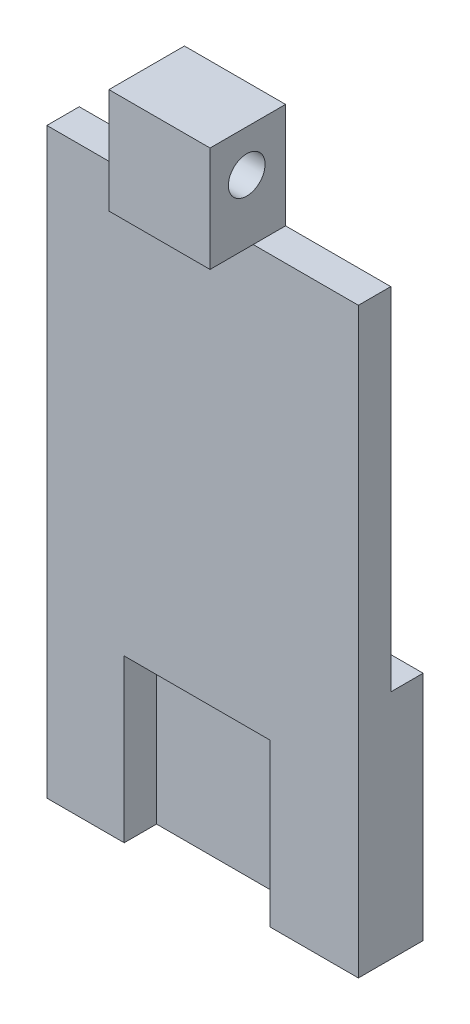
ISO-10303-21;
HEADER;
FILE_DESCRIPTION(('STEP AP214'),'2;1');
FILE_NAME('part.step','',(''),(''),'','','');
FILE_SCHEMA(('AUTOMOTIVE_DESIGN { 1 0 10303 214 1 1 1 1 }'));
ENDSEC;
DATA;
#1=APPLICATION_CONTEXT('core data for automotive mechanical design processes');
#2=APPLICATION_PROTOCOL_DEFINITION('international standard','automotive_design',2000,#1);
#3=PRODUCT_CONTEXT('',#1,'mechanical');
#4=PRODUCT('Part','Part','',(#3));
#5=PRODUCT_RELATED_PRODUCT_CATEGORY('part','',(#4));
#6=PRODUCT_DEFINITION_FORMATION('','',#4);
#7=PRODUCT_DEFINITION_CONTEXT('part definition',#1,'design');
#8=PRODUCT_DEFINITION('design','',#6,#7);
#9=PRODUCT_DEFINITION_SHAPE('','',#8);
#10=(LENGTH_UNIT() NAMED_UNIT(*) SI_UNIT(.MILLI.,.METRE.));
#11=(NAMED_UNIT(*) PLANE_ANGLE_UNIT() SI_UNIT($,.RADIAN.));
#12=(NAMED_UNIT(*) SI_UNIT($,.STERADIAN.) SOLID_ANGLE_UNIT());
#13=UNCERTAINTY_MEASURE_WITH_UNIT(LENGTH_MEASURE(1.E-05),#10,'distance_accuracy_value','');
#14=(GEOMETRIC_REPRESENTATION_CONTEXT(3) GLOBAL_UNCERTAINTY_ASSIGNED_CONTEXT((#13)) GLOBAL_UNIT_ASSIGNED_CONTEXT((#10,
#11,#12)) REPRESENTATION_CONTEXT('',''));
#15=CARTESIAN_POINT('',(0.,0.,0.));
#16=DIRECTION('',(0.,0.,1.));
#17=DIRECTION('',(1.,0.,0.));
#18=AXIS2_PLACEMENT_3D('',#15,#16,#17);
#19=CARTESIAN_POINT('',(6.2499028068027,-30.57438126,3.));
#20=DIRECTION('',(1.,0.,0.));
#21=DIRECTION('',(0.,0.,-1.));
#22=AXIS2_PLACEMENT_3D('',#19,#20,#21);
#23=PLANE('',#22);
#24=DIRECTION('',(0.,-1.,0.));
#25=VECTOR('',#24,1.);
#26=CARTESIAN_POINT('',(6.2499028068027,-30.57438126,0.));
#27=LINE('',#26,#25);
#28=CARTESIAN_POINT('',(6.2499028068027,-30.57438126,0.));
#29=VERTEX_POINT('',#28);
#30=CARTESIAN_POINT('',(6.24990280680269,-45.57438126,0.));
#31=VERTEX_POINT('',#30);
#32=EDGE_CURVE('E150',#29,#31,#27,.T.);
#33=ORIENTED_EDGE('',*,*,#32,.T.);
#34=DIRECTION('',(0.,0.,-1.));
#35=VECTOR('',#34,1.);
#36=CARTESIAN_POINT('',(6.2499028068027,-45.57438126,3.));
#37=LINE('',#36,#35);
#38=CARTESIAN_POINT('',(6.2499028068027,-45.57438126,3.));
#39=VERTEX_POINT('',#38);
#40=EDGE_CURVE('E11',#39,#31,#37,.T.);
#41=ORIENTED_EDGE('',*,*,#40,.F.);
#42=DIRECTION('',(0.,-1.,0.));
#43=VECTOR('',#42,1.);
#44=CARTESIAN_POINT('',(6.2499028068027,-30.57438126,3.));
#45=LINE('',#44,#43);
#46=CARTESIAN_POINT('',(6.2499028068027,-30.57438126,3.));
#47=VERTEX_POINT('',#46);
#48=EDGE_CURVE('E182',#47,#39,#45,.T.);
#49=ORIENTED_EDGE('',*,*,#48,.F.);
#50=DIRECTION('',(0.,0.,-1.));
#51=VECTOR('',#50,1.);
#52=CARTESIAN_POINT('',(6.2499028068027,-30.57438126,3.));
#53=LINE('',#52,#51);
#54=EDGE_CURVE('E146',#47,#29,#53,.T.);
#55=ORIENTED_EDGE('',*,*,#54,.T.);
#56=EDGE_LOOP('',(#33,#41,#49,#55));
#57=FACE_BOUND('',#56,.T.);
#58=ADVANCED_FACE('F38',(#57),#23,.F.);
#59=CARTESIAN_POINT('',(14.436666665,-30.57438126,3.));
#60=DIRECTION('',(-1.,0.,0.));
#61=DIRECTION('',(0.,0.,1.));
#62=AXIS2_PLACEMENT_3D('',#59,#60,#61);
#63=PLANE('',#62);
#64=DIRECTION('',(0.,0.,-1.));
#65=VECTOR('',#64,1.);
#66=CARTESIAN_POINT('',(14.436666665,-45.57438126,3.));
#67=LINE('',#66,#65);
#68=CARTESIAN_POINT('',(14.436666665,-45.57438126,3.));
#69=VERTEX_POINT('',#68);
#70=CARTESIAN_POINT('',(14.436666665,-45.57438126,-3.));
#71=VERTEX_POINT('',#70);
#72=EDGE_CURVE('E46',#69,#71,#67,.T.);
#73=ORIENTED_EDGE('',*,*,#72,.T.);
#74=DIRECTION('',(0.,1.,0.));
#75=VECTOR('',#74,1.);
#76=CARTESIAN_POINT('',(14.436666665,-24.1093376695065,-3.));
#77=LINE('',#76,#75);
#78=CARTESIAN_POINT('',(14.436666665,-24.1093376695065,-3.));
#79=VERTEX_POINT('',#78);
#80=EDGE_CURVE('E223',#71,#79,#77,.T.);
#81=ORIENTED_EDGE('',*,*,#80,.T.);
#82=DIRECTION('',(0.,0.,1.));
#83=VECTOR('',#82,1.);
#84=CARTESIAN_POINT('',(14.436666665,-24.1093376695065,-3.));
#85=LINE('',#84,#83);
#86=CARTESIAN_POINT('',(14.436666665,-24.1093376695065,0.));
#87=VERTEX_POINT('',#86);
#88=EDGE_CURVE('E249',#79,#87,#85,.T.);
#89=ORIENTED_EDGE('',*,*,#88,.T.);
#90=DIRECTION('',(0.,1.,0.));
#91=VECTOR('',#90,1.);
#92=CARTESIAN_POINT('',(14.436666665,-30.57438126,0.));
#93=LINE('',#92,#91);
#94=CARTESIAN_POINT('',(14.436666665,8.42561874000001,0.));
#95=VERTEX_POINT('',#94);
#96=EDGE_CURVE('E154',#87,#95,#93,.T.);
#97=ORIENTED_EDGE('',*,*,#96,.T.);
#98=DIRECTION('',(0.,0.,-1.));
#99=VECTOR('',#98,1.);
#100=CARTESIAN_POINT('',(14.436666665,8.42561874000001,3.));
#101=LINE('',#100,#99);
#102=CARTESIAN_POINT('',(14.436666665,8.42561874000001,3.));
#103=VERTEX_POINT('',#102);
#104=EDGE_CURVE('E210',#103,#95,#101,.T.);
#105=ORIENTED_EDGE('',*,*,#104,.F.);
#106=DIRECTION('',(0.,1.,0.));
#107=VECTOR('',#106,1.);
#108=CARTESIAN_POINT('',(14.436666665,-45.57438126,3.));
#109=LINE('',#108,#107);
#110=EDGE_CURVE('E226',#69,#103,#109,.T.);
#111=ORIENTED_EDGE('',*,*,#110,.F.);
#112=EDGE_LOOP('',(#73,#81,#89,#97,#105,#111));
#113=FACE_BOUND('',#112,.T.);
#114=ADVANCED_FACE('F220',(#113),#63,.F.);
#115=CARTESIAN_POINT('',(14.436666665,8.42561874000001,3.));
#116=DIRECTION('',(0.,-1.,0.));
#117=DIRECTION('',(1.,0.,0.));
#118=AXIS2_PLACEMENT_3D('',#115,#116,#117);
#119=PLANE('',#118);
#120=DIRECTION('',(-1.,0.,0.));
#121=VECTOR('',#120,1.);
#122=CARTESIAN_POINT('',(14.436666665,8.42561874000001,0.));
#123=LINE('',#122,#121);
#124=CARTESIAN_POINT('',(4.686666665,8.42561874000001,0.));
#125=VERTEX_POINT('',#124);
#126=EDGE_CURVE('E158',#95,#125,#123,.T.);
#127=ORIENTED_EDGE('',*,*,#126,.T.);
#128=DIRECTION('',(0.,0.,-1.));
#129=VECTOR('',#128,1.);
#130=CARTESIAN_POINT('',(4.686666665,8.42561874000001,3.));
#131=LINE('',#130,#129);
#132=CARTESIAN_POINT('',(4.686666665,8.42561874000001,3.));
#133=VERTEX_POINT('',#132);
#134=EDGE_CURVE('E206',#133,#125,#131,.T.);
#135=ORIENTED_EDGE('',*,*,#134,.F.);
#136=DIRECTION('',(-1.,0.,0.));
#137=VECTOR('',#136,1.);
#138=CARTESIAN_POINT('',(14.436666665,8.42561874000001,3.));
#139=LINE('',#138,#137);
#140=EDGE_CURVE('E292',#103,#133,#139,.T.);
#141=ORIENTED_EDGE('',*,*,#140,.F.);
#142=ORIENTED_EDGE('',*,*,#104,.T.);
#143=EDGE_LOOP('',(#127,#135,#141,#142));
#144=FACE_BOUND('',#143,.T.);
#145=ADVANCED_FACE('F356',(#144),#119,.F.);
#146=CARTESIAN_POINT('',(4.686666665,8.42561874000001,3.));
#147=DIRECTION('',(-1.,0.,0.));
#148=DIRECTION('',(0.,0.,1.));
#149=AXIS2_PLACEMENT_3D('',#146,#147,#148);
#150=PLANE('',#149);
#151=CARTESIAN_POINT('',(4.686666665,14.31561874,3.6));
#152=DIRECTION('',(-1.,0.,0.));
#153=DIRECTION('',(0.,0.,1.));
#154=AXIS2_PLACEMENT_3D('',#151,#152,#153);
#155=CIRCLE('',#154,1.7);
#156=CARTESIAN_POINT('',(4.686666665,14.31561874,5.3));
#157=VERTEX_POINT('',#156);
#158=EDGE_CURVE('E252',#157,#157,#155,.T.);
#159=ORIENTED_EDGE('',*,*,#158,.T.);
#160=EDGE_LOOP('',(#159));
#161=FACE_BOUND('',#160,.T.);
#162=DIRECTION('',(0.,1.,0.));
#163=VECTOR('',#162,1.);
#164=CARTESIAN_POINT('',(4.686666665,8.42561874000001,0.));
#165=LINE('',#164,#163);
#166=CARTESIAN_POINT('',(4.686666665,18.17561874,0.));
#167=VERTEX_POINT('',#166);
#168=EDGE_CURVE('E161',#125,#167,#165,.T.);
#169=ORIENTED_EDGE('',*,*,#168,.T.);
#170=DIRECTION('',(0.,0.,-1.));
#171=VECTOR('',#170,1.);
#172=CARTESIAN_POINT('',(4.686666665,18.17561874,3.));
#173=LINE('',#172,#171);
#174=CARTESIAN_POINT('',(4.686666665,18.17561874,7.));
#175=VERTEX_POINT('',#174);
#176=EDGE_CURVE('E202',#175,#167,#173,.T.);
#177=ORIENTED_EDGE('',*,*,#176,.F.);
#178=DIRECTION('',(0.,1.,0.));
#179=VECTOR('',#178,1.);
#180=CARTESIAN_POINT('',(4.686666665,18.17561874,7.));
#181=LINE('',#180,#179);
#182=CARTESIAN_POINT('',(4.686666665,8.42561874000001,7.));
#183=VERTEX_POINT('',#182);
#184=EDGE_CURVE('E268',#183,#175,#181,.T.);
#185=ORIENTED_EDGE('',*,*,#184,.F.);
#186=DIRECTION('',(0.,0.,-1.));
#187=VECTOR('',#186,1.);
#188=CARTESIAN_POINT('',(4.686666665,8.42561874000001,7.));
#189=LINE('',#188,#187);
#190=EDGE_CURVE('E276',#183,#133,#189,.T.);
#191=ORIENTED_EDGE('',*,*,#190,.T.);
#192=ORIENTED_EDGE('',*,*,#134,.T.);
#193=EDGE_LOOP('',(#169,#177,#185,#191,#192));
#194=FACE_BOUND('',#193,.T.);
#195=ADVANCED_FACE('F350',(#161,#194),#150,.F.);
#196=CARTESIAN_POINT('',(-4.686666665,18.17561874,3.));
#197=DIRECTION('',(0.,-1.,0.));
#198=DIRECTION('',(0.,0.,-1.));
#199=AXIS2_PLACEMENT_3D('',#196,#197,#198);
#200=PLANE('',#199);
#201=DIRECTION('',(-1.,0.,0.));
#202=VECTOR('',#201,1.);
#203=CARTESIAN_POINT('',(-4.686666665,18.17561874,0.));
#204=LINE('',#203,#202);
#205=CARTESIAN_POINT('',(-4.686666665,18.17561874,0.));
#206=VERTEX_POINT('',#205);
#207=EDGE_CURVE('E164',#167,#206,#204,.T.);
#208=ORIENTED_EDGE('',*,*,#207,.T.);
#209=DIRECTION('',(0.,0.,-1.));
#210=VECTOR('',#209,1.);
#211=CARTESIAN_POINT('',(-4.686666665,18.17561874,3.));
#212=LINE('',#211,#210);
#213=CARTESIAN_POINT('',(-4.686666665,18.17561874,7.));
#214=VERTEX_POINT('',#213);
#215=EDGE_CURVE('E198',#214,#206,#212,.T.);
#216=ORIENTED_EDGE('',*,*,#215,.F.);
#217=DIRECTION('',(-1.,0.,0.));
#218=VECTOR('',#217,1.);
#219=CARTESIAN_POINT('',(-4.686666665,18.17561874,7.));
#220=LINE('',#219,#218);
#221=EDGE_CURVE('E272',#175,#214,#220,.T.);
#222=ORIENTED_EDGE('',*,*,#221,.F.);
#223=ORIENTED_EDGE('',*,*,#176,.T.);
#224=EDGE_LOOP('',(#208,#216,#222,#223));
#225=FACE_BOUND('',#224,.T.);
#226=ADVANCED_FACE('F336',(#225),#200,.F.);
#227=CARTESIAN_POINT('',(-4.686666665,18.17561874,3.));
#228=DIRECTION('',(1.,0.,0.));
#229=DIRECTION('',(0.,1.,0.));
#230=AXIS2_PLACEMENT_3D('',#227,#228,#229);
#231=PLANE('',#230);
#232=CARTESIAN_POINT('',(-4.686666665,14.31561874,3.6));
#233=DIRECTION('',(-1.,0.,0.));
#234=DIRECTION('',(0.,-1.,0.));
#235=AXIS2_PLACEMENT_3D('',#232,#233,#234);
#236=CIRCLE('',#235,1.7);
#237=CARTESIAN_POINT('',(-4.686666665,12.61561874,3.6));
#238=VERTEX_POINT('',#237);
#239=EDGE_CURVE('E549',#238,#238,#236,.T.);
#240=ORIENTED_EDGE('',*,*,#239,.F.);
#241=EDGE_LOOP('',(#240));
#242=FACE_BOUND('',#241,.T.);
#243=DIRECTION('',(0.,-1.,0.));
#244=VECTOR('',#243,1.);
#245=CARTESIAN_POINT('',(-4.686666665,18.17561874,0.));
#246=LINE('',#245,#244);
#247=CARTESIAN_POINT('',(-4.686666665,8.42561874000001,0.));
#248=VERTEX_POINT('',#247);
#249=EDGE_CURVE('E167',#206,#248,#246,.T.);
#250=ORIENTED_EDGE('',*,*,#249,.T.);
#251=DIRECTION('',(0.,0.,-1.));
#252=VECTOR('',#251,1.);
#253=CARTESIAN_POINT('',(-4.686666665,8.42561874000001,3.));
#254=LINE('',#253,#252);
#255=CARTESIAN_POINT('',(-4.686666665,8.42561874000001,3.));
#256=VERTEX_POINT('',#255);
#257=EDGE_CURVE('E194',#256,#248,#254,.T.);
#258=ORIENTED_EDGE('',*,*,#257,.F.);
#259=DIRECTION('',(0.,0.,-1.));
#260=VECTOR('',#259,1.);
#261=CARTESIAN_POINT('',(-4.686666665,8.42561874000001,7.));
#262=LINE('',#261,#260);
#263=CARTESIAN_POINT('',(-4.686666665,8.42561874000001,7.));
#264=VERTEX_POINT('',#263);
#265=EDGE_CURVE('E155',#264,#256,#262,.T.);
#266=ORIENTED_EDGE('',*,*,#265,.F.);
#267=DIRECTION('',(0.,-1.,0.));
#268=VECTOR('',#267,1.);
#269=CARTESIAN_POINT('',(-4.686666665,18.17561874,7.));
#270=LINE('',#269,#268);
#271=EDGE_CURVE('E260',#214,#264,#270,.T.);
#272=ORIENTED_EDGE('',*,*,#271,.F.);
#273=ORIENTED_EDGE('',*,*,#215,.T.);
#274=EDGE_LOOP('',(#250,#258,#266,#272,#273));
#275=FACE_BOUND('',#274,.T.);
#276=ADVANCED_FACE('F345',(#242,#275),#231,.F.);
#277=CARTESIAN_POINT('',(-4.686666665,8.42561874000001,3.));
#278=DIRECTION('',(0.,-1.,0.));
#279=DIRECTION('',(1.,0.,0.));
#280=AXIS2_PLACEMENT_3D('',#277,#278,#279);
#281=PLANE('',#280);
#282=DIRECTION('',(-1.,0.,0.));
#283=VECTOR('',#282,1.);
#284=CARTESIAN_POINT('',(-4.686666665,8.42561874000001,0.));
#285=LINE('',#284,#283);
#286=CARTESIAN_POINT('',(-14.436666665,8.42561874000001,0.));
#287=VERTEX_POINT('',#286);
#288=EDGE_CURVE('E170',#248,#287,#285,.T.);
#289=ORIENTED_EDGE('',*,*,#288,.T.);
#290=DIRECTION('',(0.,0.,-1.));
#291=VECTOR('',#290,1.);
#292=CARTESIAN_POINT('',(-14.436666665,8.42561874000001,3.));
#293=LINE('',#292,#291);
#294=CARTESIAN_POINT('',(-14.436666665,8.42561874000001,3.));
#295=VERTEX_POINT('',#294);
#296=EDGE_CURVE('E190',#295,#287,#293,.T.);
#297=ORIENTED_EDGE('',*,*,#296,.F.);
#298=DIRECTION('',(-1.,0.,0.));
#299=VECTOR('',#298,1.);
#300=CARTESIAN_POINT('',(-4.686666665,8.42561874000001,3.));
#301=LINE('',#300,#299);
#302=EDGE_CURVE('E296',#256,#295,#301,.T.);
#303=ORIENTED_EDGE('',*,*,#302,.F.);
#304=ORIENTED_EDGE('',*,*,#257,.T.);
#305=EDGE_LOOP('',(#289,#297,#303,#304));
#306=FACE_BOUND('',#305,.T.);
#307=ADVANCED_FACE('F303',(#306),#281,.F.);
#308=CARTESIAN_POINT('',(-14.436666665,-30.57438126,3.));
#309=DIRECTION('',(1.,0.,0.));
#310=DIRECTION('',(0.,0.,-1.));
#311=AXIS2_PLACEMENT_3D('',#308,#309,#310);
#312=PLANE('',#311);
#313=DIRECTION('',(0.,-1.,0.));
#314=VECTOR('',#313,1.);
#315=CARTESIAN_POINT('',(-14.436666665,-30.57438126,0.));
#316=LINE('',#315,#314);
#317=CARTESIAN_POINT('',(-14.436666665,-24.1093376695065,0.));
#318=VERTEX_POINT('',#317);
#319=EDGE_CURVE('E89',#287,#318,#316,.T.);
#320=ORIENTED_EDGE('',*,*,#319,.T.);
#321=DIRECTION('',(0.,0.,1.));
#322=VECTOR('',#321,1.);
#323=CARTESIAN_POINT('',(-14.436666665,-24.1093376695065,-3.));
#324=LINE('',#323,#322);
#325=CARTESIAN_POINT('',(-14.436666665,-24.1093376695065,-3.));
#326=VERTEX_POINT('',#325);
#327=EDGE_CURVE('E53',#326,#318,#324,.T.);
#328=ORIENTED_EDGE('',*,*,#327,.F.);
#329=DIRECTION('',(0.,-1.,0.));
#330=VECTOR('',#329,1.);
#331=CARTESIAN_POINT('',(-14.436666665,-24.1093376695065,-3.));
#332=LINE('',#331,#330);
#333=CARTESIAN_POINT('',(-14.436666665,-45.57438126,-3.));
#334=VERTEX_POINT('',#333);
#335=EDGE_CURVE('E240',#326,#334,#332,.T.);
#336=ORIENTED_EDGE('',*,*,#335,.T.);
#337=DIRECTION('',(0.,0.,-1.));
#338=VECTOR('',#337,1.);
#339=CARTESIAN_POINT('',(-14.436666665,-45.57438126,3.));
#340=LINE('',#339,#338);
#341=CARTESIAN_POINT('',(-14.436666665,-45.57438126,3.));
#342=VERTEX_POINT('',#341);
#343=EDGE_CURVE('E138',#342,#334,#340,.T.);
#344=ORIENTED_EDGE('',*,*,#343,.F.);
#345=DIRECTION('',(0.,-1.,0.));
#346=VECTOR('',#345,1.);
#347=CARTESIAN_POINT('',(-14.436666665,8.42561874000001,3.));
#348=LINE('',#347,#346);
#349=EDGE_CURVE('E123',#295,#342,#348,.T.);
#350=ORIENTED_EDGE('',*,*,#349,.F.);
#351=ORIENTED_EDGE('',*,*,#296,.T.);
#352=EDGE_LOOP('',(#320,#328,#336,#344,#350,#351));
#353=FACE_BOUND('',#352,.T.);
#354=ADVANCED_FACE('F305',(#353),#312,.F.);
#355=CARTESIAN_POINT('',(-14.436666665,-45.57438126,3.));
#356=DIRECTION('',(0.,1.,0.));
#357=DIRECTION('',(0.,0.,1.));
#358=AXIS2_PLACEMENT_3D('',#355,#356,#357);
#359=PLANE('',#358);
#360=ORIENTED_EDGE('',*,*,#343,.T.);
#361=DIRECTION('',(1.,0.,0.));
#362=VECTOR('',#361,1.);
#363=CARTESIAN_POINT('',(-14.436666665,-45.57438126,-3.));
#364=LINE('',#363,#362);
#365=EDGE_CURVE('E234',#334,#71,#364,.T.);
#366=ORIENTED_EDGE('',*,*,#365,.T.);
#367=ORIENTED_EDGE('',*,*,#72,.F.);
#368=DIRECTION('',(1.,0.,0.));
#369=VECTOR('',#368,1.);
#370=CARTESIAN_POINT('',(6.2499028068027,-45.57438126,3.));
#371=LINE('',#370,#369);
#372=EDGE_CURVE('E97',#39,#69,#371,.T.);
#373=ORIENTED_EDGE('',*,*,#372,.F.);
#374=ORIENTED_EDGE('',*,*,#40,.T.);
#375=DIRECTION('',(1.,0.,0.));
#376=VECTOR('',#375,1.);
#377=CARTESIAN_POINT('',(-14.436666665,-45.57438126,0.));
#378=LINE('',#377,#376);
#379=CARTESIAN_POINT('',(-7.2700971931973,-45.57438126,0.));
#380=VERTEX_POINT('',#379);
#381=EDGE_CURVE('E134',#380,#31,#378,.T.);
#382=ORIENTED_EDGE('',*,*,#381,.F.);
#383=DIRECTION('',(0.,0.,-1.));
#384=VECTOR('',#383,1.);
#385=CARTESIAN_POINT('',(-7.2700971931973,-45.57438126,3.));
#386=LINE('',#385,#384);
#387=CARTESIAN_POINT('',(-7.2700971931973,-45.57438126,3.));
#388=VERTEX_POINT('',#387);
#389=EDGE_CURVE('E130',#388,#380,#386,.T.);
#390=ORIENTED_EDGE('',*,*,#389,.F.);
#391=DIRECTION('',(1.,0.,0.));
#392=VECTOR('',#391,1.);
#393=CARTESIAN_POINT('',(-14.436666665,-45.57438126,3.));
#394=LINE('',#393,#392);
#395=EDGE_CURVE('E116',#342,#388,#394,.T.);
#396=ORIENTED_EDGE('',*,*,#395,.F.);
#397=EDGE_LOOP('',(#360,#366,#367,#373,#374,#382,#390,#396));
#398=FACE_BOUND('',#397,.T.);
#399=ADVANCED_FACE('F131',(#398),#359,.F.);
#400=CARTESIAN_POINT('',(-7.2700971931973,-45.57438126,3.));
#401=DIRECTION('',(-1.,0.,0.));
#402=DIRECTION('',(0.,-1.,0.));
#403=AXIS2_PLACEMENT_3D('',#400,#401,#402);
#404=PLANE('',#403);
#405=DIRECTION('',(0.,1.,0.));
#406=VECTOR('',#405,1.);
#407=CARTESIAN_POINT('',(-7.2700971931973,-45.57438126,0.));
#408=LINE('',#407,#406);
#409=CARTESIAN_POINT('',(-7.2700971931973,-30.57438126,0.));
#410=VERTEX_POINT('',#409);
#411=EDGE_CURVE('E175',#380,#410,#408,.T.);
#412=ORIENTED_EDGE('',*,*,#411,.T.);
#413=DIRECTION('',(0.,0.,-1.));
#414=VECTOR('',#413,1.);
#415=CARTESIAN_POINT('',(-7.2700971931973,-30.57438126,3.));
#416=LINE('',#415,#414);
#417=CARTESIAN_POINT('',(-7.2700971931973,-30.57438126,3.));
#418=VERTEX_POINT('',#417);
#419=EDGE_CURVE('E139',#418,#410,#416,.T.);
#420=ORIENTED_EDGE('',*,*,#419,.F.);
#421=DIRECTION('',(0.,1.,0.));
#422=VECTOR('',#421,1.);
#423=CARTESIAN_POINT('',(-7.2700971931973,-45.57438126,3.));
#424=LINE('',#423,#422);
#425=EDGE_CURVE('E120',#388,#418,#424,.T.);
#426=ORIENTED_EDGE('',*,*,#425,.F.);
#427=ORIENTED_EDGE('',*,*,#389,.T.);
#428=EDGE_LOOP('',(#412,#420,#426,#427));
#429=FACE_BOUND('',#428,.T.);
#430=ADVANCED_FACE('F141',(#429),#404,.F.);
#431=CARTESIAN_POINT('',(-7.2700971931973,-30.57438126,3.));
#432=DIRECTION('',(0.,1.,0.));
#433=DIRECTION('',(-1.,0.,0.));
#434=AXIS2_PLACEMENT_3D('',#431,#432,#433);
#435=PLANE('',#434);
#436=DIRECTION('',(1.,0.,0.));
#437=VECTOR('',#436,1.);
#438=CARTESIAN_POINT('',(-7.2700971931973,-30.57438126,0.));
#439=LINE('',#438,#437);
#440=EDGE_CURVE('E178',#410,#29,#439,.T.);
#441=ORIENTED_EDGE('',*,*,#440,.T.);
#442=ORIENTED_EDGE('',*,*,#54,.F.);
#443=DIRECTION('',(1.,0.,0.));
#444=VECTOR('',#443,1.);
#445=CARTESIAN_POINT('',(-7.2700971931973,-30.57438126,3.));
#446=LINE('',#445,#444);
#447=EDGE_CURVE('E62',#418,#47,#446,.T.);
#448=ORIENTED_EDGE('',*,*,#447,.F.);
#449=ORIENTED_EDGE('',*,*,#419,.T.);
#450=EDGE_LOOP('',(#441,#442,#448,#449));
#451=FACE_BOUND('',#450,.T.);
#452=ADVANCED_FACE('F364',(#451),#435,.F.);
#453=CARTESIAN_POINT('',(0.,0.,3.));
#454=DIRECTION('',(0.,0.,1.));
#455=DIRECTION('',(1.,0.,0.));
#456=AXIS2_PLACEMENT_3D('',#453,#454,#455);
#457=PLANE('',#456);
#458=DIRECTION('',(1.,0.,0.));
#459=VECTOR('',#458,1.);
#460=CARTESIAN_POINT('',(-4.686666665,8.42561874000001,3.));
#461=LINE('',#460,#459);
#462=EDGE_CURVE('E257',#256,#133,#461,.T.);
#463=ORIENTED_EDGE('',*,*,#462,.F.);
#464=ORIENTED_EDGE('',*,*,#302,.T.);
#465=ORIENTED_EDGE('',*,*,#349,.T.);
#466=ORIENTED_EDGE('',*,*,#395,.T.);
#467=ORIENTED_EDGE('',*,*,#425,.T.);
#468=ORIENTED_EDGE('',*,*,#447,.T.);
#469=ORIENTED_EDGE('',*,*,#48,.T.);
#470=ORIENTED_EDGE('',*,*,#372,.T.);
#471=ORIENTED_EDGE('',*,*,#110,.T.);
#472=ORIENTED_EDGE('',*,*,#140,.T.);
#473=EDGE_LOOP('',(#463,#464,#465,#466,#467,#468,#469,#470,#471,#472));
#474=FACE_BOUND('',#473,.T.);
#475=ADVANCED_FACE('F118',(#474),#457,.T.);
#476=CARTESIAN_POINT('',(0.,0.,0.));
#477=DIRECTION('',(0.,0.,1.));
#478=DIRECTION('',(1.,0.,0.));
#479=AXIS2_PLACEMENT_3D('',#476,#477,#478);
#480=PLANE('',#479);
#481=ORIENTED_EDGE('',*,*,#96,.F.);
#482=DIRECTION('',(-1.,0.,0.));
#483=VECTOR('',#482,1.);
#484=CARTESIAN_POINT('',(-14.436666665,-24.1093376695065,0.));
#485=LINE('',#484,#483);
#486=EDGE_CURVE('E243',#87,#318,#485,.T.);
#487=ORIENTED_EDGE('',*,*,#486,.T.);
#488=ORIENTED_EDGE('',*,*,#319,.F.);
#489=ORIENTED_EDGE('',*,*,#288,.F.);
#490=ORIENTED_EDGE('',*,*,#249,.F.);
#491=ORIENTED_EDGE('',*,*,#207,.F.);
#492=ORIENTED_EDGE('',*,*,#168,.F.);
#493=ORIENTED_EDGE('',*,*,#126,.F.);
#494=EDGE_LOOP('',(#481,#487,#488,#489,#490,#491,#492,#493));
#495=FACE_BOUND('',#494,.T.);
#496=ADVANCED_FACE('F352',(#495),#480,.F.);
#497=CARTESIAN_POINT('',(-4.686666665,8.42561874000001,7.));
#498=DIRECTION('',(0.,1.,0.));
#499=DIRECTION('',(0.,0.,1.));
#500=AXIS2_PLACEMENT_3D('',#497,#498,#499);
#501=PLANE('',#500);
#502=ORIENTED_EDGE('',*,*,#462,.T.);
#503=ORIENTED_EDGE('',*,*,#190,.F.);
#504=DIRECTION('',(1.,0.,0.));
#505=VECTOR('',#504,1.);
#506=CARTESIAN_POINT('',(-4.686666665,8.42561874000001,7.));
#507=LINE('',#506,#505);
#508=EDGE_CURVE('E264',#264,#183,#507,.T.);
#509=ORIENTED_EDGE('',*,*,#508,.F.);
#510=ORIENTED_EDGE('',*,*,#265,.T.);
#511=EDGE_LOOP('',(#502,#503,#509,#510));
#512=FACE_BOUND('',#511,.T.);
#513=ADVANCED_FACE('F347',(#512),#501,.F.);
#514=CARTESIAN_POINT('',(0.,0.,7.));
#515=DIRECTION('',(0.,0.,1.));
#516=DIRECTION('',(1.,0.,0.));
#517=AXIS2_PLACEMENT_3D('',#514,#515,#516);
#518=PLANE('',#517);
#519=ORIENTED_EDGE('',*,*,#271,.T.);
#520=ORIENTED_EDGE('',*,*,#508,.T.);
#521=ORIENTED_EDGE('',*,*,#184,.T.);
#522=ORIENTED_EDGE('',*,*,#221,.T.);
#523=EDGE_LOOP('',(#519,#520,#521,#522));
#524=FACE_BOUND('',#523,.T.);
#525=ADVANCED_FACE('F342',(#524),#518,.T.);
#526=CARTESIAN_POINT('',(0.,0.,0.));
#527=DIRECTION('',(0.,0.,1.));
#528=DIRECTION('',(1.,0.,0.));
#529=AXIS2_PLACEMENT_3D('',#526,#527,#528);
#530=PLANE('',#529);
#531=ORIENTED_EDGE('',*,*,#32,.F.);
#532=ORIENTED_EDGE('',*,*,#440,.F.);
#533=ORIENTED_EDGE('',*,*,#411,.F.);
#534=ORIENTED_EDGE('',*,*,#381,.T.);
#535=EDGE_LOOP('',(#531,#532,#533,#534));
#536=FACE_BOUND('',#535,.T.);
#537=ADVANCED_FACE('F362',(#536),#530,.T.);
#538=CARTESIAN_POINT('',(-14.436666665,-24.1093376695065,-3.));
#539=DIRECTION('',(0.,1.,0.));
#540=DIRECTION('',(0.,0.,1.));
#541=AXIS2_PLACEMENT_3D('',#538,#539,#540);
#542=PLANE('',#541);
#543=ORIENTED_EDGE('',*,*,#486,.F.);
#544=ORIENTED_EDGE('',*,*,#88,.F.);
#545=DIRECTION('',(-1.,0.,0.));
#546=VECTOR('',#545,1.);
#547=CARTESIAN_POINT('',(-14.436666665,-24.1093376695065,-3.));
#548=LINE('',#547,#546);
#549=EDGE_CURVE('E236',#79,#326,#548,.T.);
#550=ORIENTED_EDGE('',*,*,#549,.T.);
#551=ORIENTED_EDGE('',*,*,#327,.T.);
#552=EDGE_LOOP('',(#543,#544,#550,#551));
#553=FACE_BOUND('',#552,.T.);
#554=ADVANCED_FACE('F311',(#553),#542,.T.);
#555=CARTESIAN_POINT('',(0.,0.,-3.));
#556=DIRECTION('',(0.,0.,1.));
#557=DIRECTION('',(1.,0.,0.));
#558=AXIS2_PLACEMENT_3D('',#555,#556,#557);
#559=PLANE('',#558);
#560=ORIENTED_EDGE('',*,*,#335,.F.);
#561=ORIENTED_EDGE('',*,*,#549,.F.);
#562=ORIENTED_EDGE('',*,*,#80,.F.);
#563=ORIENTED_EDGE('',*,*,#365,.F.);
#564=EDGE_LOOP('',(#560,#561,#562,#563));
#565=FACE_BOUND('',#564,.T.);
#566=ADVANCED_FACE('F233',(#565),#559,.F.);
#567=CARTESIAN_POINT('',(5.313333335,14.31561874,3.6));
#568=DIRECTION('',(-1.,0.,0.));
#569=DIRECTION('',(0.,-1.,0.));
#570=AXIS2_PLACEMENT_3D('',#567,#568,#569);
#571=CYLINDRICAL_SURFACE('',#570,1.7);
#572=ORIENTED_EDGE('',*,*,#239,.T.);
#573=EDGE_LOOP('',(#572));
#574=FACE_BOUND('',#573,.T.);
#575=ORIENTED_EDGE('',*,*,#158,.F.);
#576=EDGE_LOOP('',(#575));
#577=FACE_BOUND('',#576,.T.);
#578=ADVANCED_FACE('F445',(#574,#577),#571,.F.);
#579=CLOSED_SHELL('',(#58,#114,#145,#195,#226,#276,#307,#354,#399,#430,#452,#475,#496,#513,#525,
#537,#554,#566,#578));
#580=MANIFOLD_SOLID_BREP('B2',#579);
#581=ADVANCED_BREP_SHAPE_REPRESENTATION('',(#18,#580),#14);
#582=SHAPE_DEFINITION_REPRESENTATION(#9,#581);
ENDSEC;
END-ISO-10303-21;
